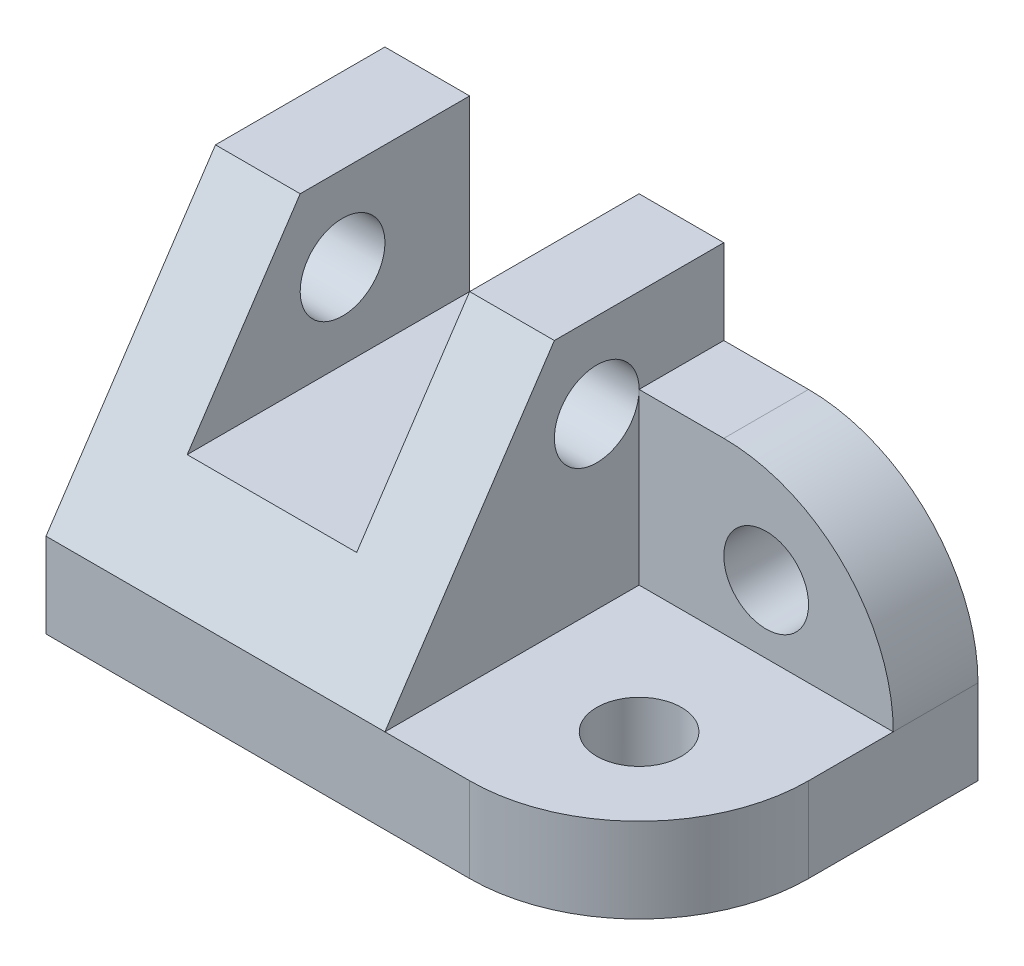
ISO-10303-21;
HEADER;
FILE_DESCRIPTION(('STEP AP214'),'2;1');
FILE_NAME('part.step','',(''),(''),'','','');
FILE_SCHEMA(('AUTOMOTIVE_DESIGN { 1 0 10303 214 1 1 1 1 }'));
ENDSEC;
DATA;
#1=APPLICATION_CONTEXT('core data for automotive mechanical design processes');
#2=APPLICATION_PROTOCOL_DEFINITION('international standard','automotive_design',2000,#1);
#3=PRODUCT_CONTEXT('',#1,'mechanical');
#4=PRODUCT('Part','Part','',(#3));
#5=PRODUCT_RELATED_PRODUCT_CATEGORY('part','',(#4));
#6=PRODUCT_DEFINITION_FORMATION('','',#4);
#7=PRODUCT_DEFINITION_CONTEXT('part definition',#1,'design');
#8=PRODUCT_DEFINITION('design','',#6,#7);
#9=PRODUCT_DEFINITION_SHAPE('','',#8);
#10=(LENGTH_UNIT() NAMED_UNIT(*) SI_UNIT(.MILLI.,.METRE.));
#11=(NAMED_UNIT(*) PLANE_ANGLE_UNIT() SI_UNIT($,.RADIAN.));
#12=(NAMED_UNIT(*) SI_UNIT($,.STERADIAN.) SOLID_ANGLE_UNIT());
#13=UNCERTAINTY_MEASURE_WITH_UNIT(LENGTH_MEASURE(1.E-05),#10,'distance_accuracy_value','');
#14=(GEOMETRIC_REPRESENTATION_CONTEXT(3) GLOBAL_UNCERTAINTY_ASSIGNED_CONTEXT((#13)) GLOBAL_UNIT_ASSIGNED_CONTEXT((#10,
#11,#12)) REPRESENTATION_CONTEXT('',''));
#15=CARTESIAN_POINT('',(0.,0.,0.));
#16=DIRECTION('',(0.,0.,1.));
#17=DIRECTION('',(1.,0.,0.));
#18=AXIS2_PLACEMENT_3D('',#15,#16,#17);
#19=CARTESIAN_POINT('',(-200.,0.,-200.));
#20=DIRECTION('',(0.,-1.,0.));
#21=DIRECTION('',(0.,0.,-1.));
#22=AXIS2_PLACEMENT_3D('',#19,#20,#21);
#23=CYLINDRICAL_SURFACE('',#22,200.);
#24=DIRECTION('',(0.,1.,0.));
#25=VECTOR('',#24,1.);
#26=CARTESIAN_POINT('',(-200.,0.,0.));
#27=LINE('',#26,#25);
#28=CARTESIAN_POINT('',(-200.,0.,0.));
#29=VERTEX_POINT('',#28);
#30=CARTESIAN_POINT('',(-200.,100.,0.));
#31=VERTEX_POINT('',#30);
#32=EDGE_CURVE('E167',#29,#31,#27,.T.);
#33=ORIENTED_EDGE('',*,*,#32,.F.);
#34=CARTESIAN_POINT('',(-200.,0.,-200.));
#35=DIRECTION('',(0.,-1.,0.));
#36=DIRECTION('',(0.,0.,-1.));
#37=AXIS2_PLACEMENT_3D('',#34,#35,#36);
#38=CIRCLE('',#37,200.);
#39=CARTESIAN_POINT('',(0.,0.,-200.));
#40=VERTEX_POINT('',#39);
#41=EDGE_CURVE('E47',#40,#29,#38,.T.);
#42=ORIENTED_EDGE('',*,*,#41,.F.);
#43=DIRECTION('',(0.,1.,0.));
#44=VECTOR('',#43,1.);
#45=CARTESIAN_POINT('',(0.,0.,-200.));
#46=LINE('',#45,#44);
#47=CARTESIAN_POINT('',(0.,100.,-200.));
#48=VERTEX_POINT('',#47);
#49=EDGE_CURVE('E245',#48,#40,#46,.F.);
#50=ORIENTED_EDGE('',*,*,#49,.F.);
#51=CARTESIAN_POINT('',(-200.,100.,-200.));
#52=DIRECTION('',(0.,-1.,0.));
#53=DIRECTION('',(0.,0.,-1.));
#54=AXIS2_PLACEMENT_3D('',#51,#52,#53);
#55=CIRCLE('',#54,200.);
#56=EDGE_CURVE('E11',#31,#48,#55,.F.);
#57=ORIENTED_EDGE('',*,*,#56,.F.);
#58=EDGE_LOOP('',(#33,#42,#50,#57));
#59=FACE_BOUND('',#58,.T.);
#60=ADVANCED_FACE('F38',(#59),#23,.T.);
#61=CARTESIAN_POINT('',(-200.,100.,-300.));
#62=DIRECTION('',(0.,0.,-1.));
#63=DIRECTION('',(-1.,0.,0.));
#64=AXIS2_PLACEMENT_3D('',#61,#62,#63);
#65=CYLINDRICAL_SURFACE('',#64,200.);
#66=DIRECTION('',(0.,0.,-1.));
#67=VECTOR('',#66,1.);
#68=CARTESIAN_POINT('',(-200.,300.,-300.));
#69=LINE('',#68,#67);
#70=CARTESIAN_POINT('',(-200.,300.,-300.));
#71=VERTEX_POINT('',#70);
#72=CARTESIAN_POINT('',(-200.,300.,-400.));
#73=VERTEX_POINT('',#72);
#74=EDGE_CURVE('E229',#71,#73,#69,.T.);
#75=ORIENTED_EDGE('',*,*,#74,.F.);
#76=CARTESIAN_POINT('',(-200.,100.,-300.));
#77=DIRECTION('',(0.,0.,-1.));
#78=DIRECTION('',(-1.,0.,0.));
#79=AXIS2_PLACEMENT_3D('',#76,#77,#78);
#80=CIRCLE('',#79,200.);
#81=CARTESIAN_POINT('',(0.,100.,-300.));
#82=VERTEX_POINT('',#81);
#83=EDGE_CURVE('E237',#82,#71,#80,.F.);
#84=ORIENTED_EDGE('',*,*,#83,.F.);
#85=DIRECTION('',(0.,0.,-1.));
#86=VECTOR('',#85,1.);
#87=CARTESIAN_POINT('',(0.,100.,0.));
#88=LINE('',#87,#86);
#89=CARTESIAN_POINT('',(0.,100.,-400.));
#90=VERTEX_POINT('',#89);
#91=EDGE_CURVE('E233',#90,#82,#88,.F.);
#92=ORIENTED_EDGE('',*,*,#91,.F.);
#93=CARTESIAN_POINT('',(-200.,100.,-400.));
#94=DIRECTION('',(0.,0.,-1.));
#95=DIRECTION('',(-1.,0.,0.));
#96=AXIS2_PLACEMENT_3D('',#93,#94,#95);
#97=CIRCLE('',#96,200.);
#98=EDGE_CURVE('E240',#73,#90,#97,.T.);
#99=ORIENTED_EDGE('',*,*,#98,.F.);
#100=EDGE_LOOP('',(#75,#84,#92,#99));
#101=FACE_BOUND('',#100,.T.);
#102=ADVANCED_FACE('F342',(#101),#65,.T.);
#103=CARTESIAN_POINT('',(-700.,400.,0.));
#104=DIRECTION('',(0.,1.,0.));
#105=DIRECTION('',(0.,0.,1.));
#106=AXIS2_PLACEMENT_3D('',#103,#104,#105);
#107=PLANE('',#106);
#108=DIRECTION('',(1.,0.,0.));
#109=VECTOR('',#108,1.);
#110=CARTESIAN_POINT('',(-700.,400.,-200.));
#111=LINE('',#110,#109);
#112=CARTESIAN_POINT('',(-400.,400.,-200.));
#113=VERTEX_POINT('',#112);
#114=CARTESIAN_POINT('',(-300.,400.,-200.));
#115=VERTEX_POINT('',#114);
#116=EDGE_CURVE('E174',#113,#115,#111,.T.);
#117=ORIENTED_EDGE('',*,*,#116,.T.);
#118=DIRECTION('',(0.,0.,1.));
#119=VECTOR('',#118,1.);
#120=CARTESIAN_POINT('',(-300.,400.,-400.));
#121=LINE('',#120,#119);
#122=CARTESIAN_POINT('',(-300.,400.,-400.));
#123=VERTEX_POINT('',#122);
#124=EDGE_CURVE('E152',#123,#115,#121,.T.);
#125=ORIENTED_EDGE('',*,*,#124,.F.);
#126=DIRECTION('',(1.,0.,0.));
#127=VECTOR('',#126,1.);
#128=CARTESIAN_POINT('',(-700.,400.,-400.));
#129=LINE('',#128,#127);
#130=CARTESIAN_POINT('',(-400.,400.,-400.));
#131=VERTEX_POINT('',#130);
#132=EDGE_CURVE('E211',#131,#123,#129,.T.);
#133=ORIENTED_EDGE('',*,*,#132,.F.);
#134=DIRECTION('',(0.,0.,-1.));
#135=VECTOR('',#134,1.);
#136=CARTESIAN_POINT('',(-400.,400.,300.));
#137=LINE('',#136,#135);
#138=EDGE_CURVE('E297',#113,#131,#137,.T.);
#139=ORIENTED_EDGE('',*,*,#138,.F.);
#140=EDGE_LOOP('',(#117,#125,#133,#139));
#141=FACE_BOUND('',#140,.T.);
#142=ADVANCED_FACE('F318',(#141),#107,.T.);
#143=CARTESIAN_POINT('',(-700.,100.,0.));
#144=DIRECTION('',(0.,-0.554700196225229,-0.832050294337844));
#145=DIRECTION('',(0.,0.832050294337844,-0.554700196225229));
#146=AXIS2_PLACEMENT_3D('',#143,#144,#145);
#147=PLANE('',#146);
#148=DIRECTION('',(0.,-0.832050294337844,0.554700196225229));
#149=VECTOR('',#148,1.);
#150=CARTESIAN_POINT('',(-300.,400.,-200.));
#151=LINE('',#150,#149);
#152=CARTESIAN_POINT('',(-300.,100.,0.));
#153=VERTEX_POINT('',#152);
#154=EDGE_CURVE('E147',#115,#153,#151,.T.);
#155=ORIENTED_EDGE('',*,*,#154,.F.);
#156=ORIENTED_EDGE('',*,*,#116,.F.);
#157=DIRECTION('',(0.,-0.832050294337844,0.554700196225229));
#158=VECTOR('',#157,1.);
#159=CARTESIAN_POINT('',(-400.,100.,0.));
#160=LINE('',#159,#158);
#161=CARTESIAN_POINT('',(-400.,200.,-66.6666666666666));
#162=VERTEX_POINT('',#161);
#163=EDGE_CURVE('E210',#113,#162,#160,.T.);
#164=ORIENTED_EDGE('',*,*,#163,.T.);
#165=DIRECTION('',(-1.,0.,0.));
#166=VECTOR('',#165,1.);
#167=CARTESIAN_POINT('',(-700.,200.,-66.6666666666667));
#168=LINE('',#167,#166);
#169=CARTESIAN_POINT('',(-600.,200.,-66.6666666666667));
#170=VERTEX_POINT('',#169);
#171=EDGE_CURVE('E221',#162,#170,#168,.T.);
#172=ORIENTED_EDGE('',*,*,#171,.T.);
#173=DIRECTION('',(0.,0.832050294337844,-0.554700196225229));
#174=VECTOR('',#173,1.);
#175=CARTESIAN_POINT('',(-600.,100.,0.));
#176=LINE('',#175,#174);
#177=CARTESIAN_POINT('',(-600.,400.,-200.));
#178=VERTEX_POINT('',#177);
#179=EDGE_CURVE('E225',#170,#178,#176,.T.);
#180=ORIENTED_EDGE('',*,*,#179,.T.);
#181=CARTESIAN_POINT('',(-700.,400.,-200.));
#182=VERTEX_POINT('',#181);
#183=EDGE_CURVE('E178',#182,#178,#111,.T.);
#184=ORIENTED_EDGE('',*,*,#183,.F.);
#185=DIRECTION('',(0.,0.832050294337844,-0.554700196225229));
#186=VECTOR('',#185,1.);
#187=CARTESIAN_POINT('',(-700.,100.,0.));
#188=LINE('',#187,#186);
#189=CARTESIAN_POINT('',(-700.,100.,0.));
#190=VERTEX_POINT('',#189);
#191=EDGE_CURVE('E172',#190,#182,#188,.T.);
#192=ORIENTED_EDGE('',*,*,#191,.F.);
#193=DIRECTION('',(1.,0.,0.));
#194=VECTOR('',#193,1.);
#195=CARTESIAN_POINT('',(-700.,100.,0.));
#196=LINE('',#195,#194);
#197=EDGE_CURVE('E165',#190,#153,#196,.T.);
#198=ORIENTED_EDGE('',*,*,#197,.T.);
#199=EDGE_LOOP('',(#155,#156,#164,#172,#180,#184,#192,#198));
#200=FACE_BOUND('',#199,.T.);
#201=ADVANCED_FACE('F170',(#200),#147,.F.);
#202=DIRECTION('',(0.,0.,-1.));
#203=VECTOR('',#202,1.);
#204=CARTESIAN_POINT('',(-600.,400.,300.));
#205=LINE('',#204,#203);
#206=CARTESIAN_POINT('',(-600.,400.,-400.));
#207=VERTEX_POINT('',#206);
#208=EDGE_CURVE('E180',#178,#207,#205,.T.);
#209=ORIENTED_EDGE('',*,*,#208,.T.);
#210=CARTESIAN_POINT('',(-700.,400.,-400.));
#211=VERTEX_POINT('',#210);
#212=EDGE_CURVE('E206',#211,#207,#129,.T.);
#213=ORIENTED_EDGE('',*,*,#212,.F.);
#214=DIRECTION('',(0.,0.,1.));
#215=VECTOR('',#214,1.);
#216=CARTESIAN_POINT('',(-700.,400.,0.));
#217=LINE('',#216,#215);
#218=EDGE_CURVE('E195',#211,#182,#217,.T.);
#219=ORIENTED_EDGE('',*,*,#218,.T.);
#220=ORIENTED_EDGE('',*,*,#183,.T.);
#221=EDGE_LOOP('',(#209,#213,#219,#220));
#222=FACE_BOUND('',#221,.T.);
#223=ADVANCED_FACE('F323',(#222),#107,.T.);
#224=CARTESIAN_POINT('',(-700.,0.,0.));
#225=DIRECTION('',(0.,0.,1.));
#226=DIRECTION('',(1.,0.,0.));
#227=AXIS2_PLACEMENT_3D('',#224,#225,#226);
#228=PLANE('',#227);
#229=DIRECTION('',(1.,0.,0.));
#230=VECTOR('',#229,1.);
#231=CARTESIAN_POINT('',(-700.,0.,0.));
#232=LINE('',#231,#230);
#233=CARTESIAN_POINT('',(-700.,0.,0.));
#234=VERTEX_POINT('',#233);
#235=EDGE_CURVE('E199',#234,#29,#232,.T.);
#236=ORIENTED_EDGE('',*,*,#235,.T.);
#237=ORIENTED_EDGE('',*,*,#32,.T.);
#238=DIRECTION('',(1.,0.,0.));
#239=VECTOR('',#238,1.);
#240=CARTESIAN_POINT('',(-300.,100.,0.));
#241=LINE('',#240,#239);
#242=EDGE_CURVE('E139',#153,#31,#241,.T.);
#243=ORIENTED_EDGE('',*,*,#242,.F.);
#244=ORIENTED_EDGE('',*,*,#197,.F.);
#245=DIRECTION('',(0.,-1.,0.));
#246=VECTOR('',#245,1.);
#247=CARTESIAN_POINT('',(-700.,0.,0.));
#248=LINE('',#247,#246);
#249=EDGE_CURVE('E183',#190,#234,#248,.T.);
#250=ORIENTED_EDGE('',*,*,#249,.T.);
#251=EDGE_LOOP('',(#236,#237,#243,#244,#250));
#252=FACE_BOUND('',#251,.T.);
#253=ADVANCED_FACE('F164',(#252),#228,.T.);
#254=CARTESIAN_POINT('',(-700.,400.,-400.));
#255=DIRECTION('',(0.,0.,-1.));
#256=DIRECTION('',(-1.,0.,0.));
#257=AXIS2_PLACEMENT_3D('',#254,#255,#256);
#258=PLANE('',#257);
#259=CARTESIAN_POINT('',(-150.,180.,-400.));
#260=DIRECTION('',(0.,0.,-1.));
#261=DIRECTION('',(-1.,0.,0.));
#262=AXIS2_PLACEMENT_3D('',#259,#260,#261);
#263=CIRCLE('',#262,50.);
#264=CARTESIAN_POINT('',(-200.,180.,-400.));
#265=VERTEX_POINT('',#264);
#266=EDGE_CURVE('E478',#265,#265,#263,.T.);
#267=ORIENTED_EDGE('',*,*,#266,.F.);
#268=EDGE_LOOP('',(#267));
#269=FACE_BOUND('',#268,.T.);
#270=DIRECTION('',(1.,0.,0.));
#271=VECTOR('',#270,1.);
#272=CARTESIAN_POINT('',(-300.,300.,-400.));
#273=LINE('',#272,#271);
#274=CARTESIAN_POINT('',(-300.,300.,-400.));
#275=VERTEX_POINT('',#274);
#276=EDGE_CURVE('E277',#275,#73,#273,.T.);
#277=ORIENTED_EDGE('',*,*,#276,.T.);
#278=ORIENTED_EDGE('',*,*,#98,.T.);
#279=DIRECTION('',(0.,1.,0.));
#280=VECTOR('',#279,1.);
#281=CARTESIAN_POINT('',(0.,400.,-400.));
#282=LINE('',#281,#280);
#283=CARTESIAN_POINT('',(0.,0.,-400.));
#284=VERTEX_POINT('',#283);
#285=EDGE_CURVE('E187',#284,#90,#282,.T.);
#286=ORIENTED_EDGE('',*,*,#285,.F.);
#287=DIRECTION('',(1.,0.,0.));
#288=VECTOR('',#287,1.);
#289=CARTESIAN_POINT('',(-700.,0.,-400.));
#290=LINE('',#289,#288);
#291=CARTESIAN_POINT('',(-700.,0.,-400.));
#292=VERTEX_POINT('',#291);
#293=EDGE_CURVE('E212',#292,#284,#290,.T.);
#294=ORIENTED_EDGE('',*,*,#293,.F.);
#295=DIRECTION('',(0.,1.,0.));
#296=VECTOR('',#295,1.);
#297=CARTESIAN_POINT('',(-700.,400.,-400.));
#298=LINE('',#297,#296);
#299=EDGE_CURVE('E191',#292,#211,#298,.T.);
#300=ORIENTED_EDGE('',*,*,#299,.T.);
#301=ORIENTED_EDGE('',*,*,#212,.T.);
#302=DIRECTION('',(0.,1.,0.));
#303=VECTOR('',#302,1.);
#304=CARTESIAN_POINT('',(-600.,400.,-400.));
#305=LINE('',#304,#303);
#306=CARTESIAN_POINT('',(-600.,200.,-400.));
#307=VERTEX_POINT('',#306);
#308=EDGE_CURVE('E294',#307,#207,#305,.T.);
#309=ORIENTED_EDGE('',*,*,#308,.F.);
#310=DIRECTION('',(-1.,0.,0.));
#311=VECTOR('',#310,1.);
#312=CARTESIAN_POINT('',(-600.,200.,-400.));
#313=LINE('',#312,#311);
#314=CARTESIAN_POINT('',(-400.,200.,-400.));
#315=VERTEX_POINT('',#314);
#316=EDGE_CURVE('E290',#315,#307,#313,.T.);
#317=ORIENTED_EDGE('',*,*,#316,.F.);
#318=DIRECTION('',(0.,-1.,0.));
#319=VECTOR('',#318,1.);
#320=CARTESIAN_POINT('',(-400.,200.,-400.));
#321=LINE('',#320,#319);
#322=EDGE_CURVE('E280',#131,#315,#321,.T.);
#323=ORIENTED_EDGE('',*,*,#322,.F.);
#324=ORIENTED_EDGE('',*,*,#132,.T.);
#325=DIRECTION('',(0.,1.,0.));
#326=VECTOR('',#325,1.);
#327=CARTESIAN_POINT('',(-300.,300.,-400.));
#328=LINE('',#327,#326);
#329=EDGE_CURVE('E491',#275,#123,#328,.T.);
#330=ORIENTED_EDGE('',*,*,#329,.F.);
#331=EDGE_LOOP('',(#277,#278,#286,#294,#300,#301,#309,#317,#323,#324,#330));
#332=FACE_BOUND('',#331,.T.);
#333=ADVANCED_FACE('F261',(#269,#332),#258,.T.);
#334=CARTESIAN_POINT('',(-700.,0.,0.));
#335=DIRECTION('',(0.,-1.,0.));
#336=DIRECTION('',(0.,0.,-1.));
#337=AXIS2_PLACEMENT_3D('',#334,#335,#336);
#338=PLANE('',#337);
#339=CARTESIAN_POINT('',(-150.,0.,-150.));
#340=DIRECTION('',(0.,-1.,0.));
#341=DIRECTION('',(0.,0.,-1.));
#342=AXIS2_PLACEMENT_3D('',#339,#340,#341);
#343=CIRCLE('',#342,50.);
#344=CARTESIAN_POINT('',(-150.,0.,-200.));
#345=VERTEX_POINT('',#344);
#346=EDGE_CURVE('E268',#345,#345,#343,.T.);
#347=ORIENTED_EDGE('',*,*,#346,.F.);
#348=EDGE_LOOP('',(#347));
#349=FACE_BOUND('',#348,.T.);
#350=DIRECTION('',(0.,0.,-1.));
#351=VECTOR('',#350,1.);
#352=CARTESIAN_POINT('',(0.,0.,0.));
#353=LINE('',#352,#351);
#354=EDGE_CURVE('E200',#40,#284,#353,.T.);
#355=ORIENTED_EDGE('',*,*,#354,.F.);
#356=ORIENTED_EDGE('',*,*,#41,.T.);
#357=ORIENTED_EDGE('',*,*,#235,.F.);
#358=DIRECTION('',(0.,0.,-1.));
#359=VECTOR('',#358,1.);
#360=CARTESIAN_POINT('',(-700.,0.,0.));
#361=LINE('',#360,#359);
#362=EDGE_CURVE('E186',#234,#292,#361,.T.);
#363=ORIENTED_EDGE('',*,*,#362,.T.);
#364=ORIENTED_EDGE('',*,*,#293,.T.);
#365=EDGE_LOOP('',(#355,#356,#357,#363,#364));
#366=FACE_BOUND('',#365,.T.);
#367=ADVANCED_FACE('F252',(#349,#366),#338,.T.);
#368=CARTESIAN_POINT('',(-700.,0.,0.));
#369=DIRECTION('',(-1.,0.,0.));
#370=DIRECTION('',(0.,0.,1.));
#371=AXIS2_PLACEMENT_3D('',#368,#369,#370);
#372=PLANE('',#371);
#373=CARTESIAN_POINT('',(-700.,300.,-250.));
#374=DIRECTION('',(-1.,0.,0.));
#375=DIRECTION('',(0.,0.,1.));
#376=AXIS2_PLACEMENT_3D('',#373,#374,#375);
#377=CIRCLE('',#376,50.);
#378=CARTESIAN_POINT('',(-700.,300.,-200.));
#379=VERTEX_POINT('',#378);
#380=EDGE_CURVE('E500',#379,#379,#377,.T.);
#381=ORIENTED_EDGE('',*,*,#380,.F.);
#382=EDGE_LOOP('',(#381));
#383=FACE_BOUND('',#382,.T.);
#384=ORIENTED_EDGE('',*,*,#191,.T.);
#385=ORIENTED_EDGE('',*,*,#218,.F.);
#386=ORIENTED_EDGE('',*,*,#299,.F.);
#387=ORIENTED_EDGE('',*,*,#362,.F.);
#388=ORIENTED_EDGE('',*,*,#249,.F.);
#389=EDGE_LOOP('',(#384,#385,#386,#387,#388));
#390=FACE_BOUND('',#389,.T.);
#391=ADVANCED_FACE('F255',(#383,#390),#372,.T.);
#392=CARTESIAN_POINT('',(0.,0.,0.));
#393=DIRECTION('',(-1.,0.,0.));
#394=DIRECTION('',(0.,0.,1.));
#395=AXIS2_PLACEMENT_3D('',#392,#393,#394);
#396=PLANE('',#395);
#397=DIRECTION('',(0.,0.,-1.));
#398=VECTOR('',#397,1.);
#399=CARTESIAN_POINT('',(0.,100.,0.));
#400=LINE('',#399,#398);
#401=EDGE_CURVE('E158',#48,#82,#400,.T.);
#402=ORIENTED_EDGE('',*,*,#401,.F.);
#403=ORIENTED_EDGE('',*,*,#49,.T.);
#404=ORIENTED_EDGE('',*,*,#354,.T.);
#405=ORIENTED_EDGE('',*,*,#285,.T.);
#406=ORIENTED_EDGE('',*,*,#91,.T.);
#407=EDGE_LOOP('',(#402,#403,#404,#405,#406));
#408=FACE_BOUND('',#407,.T.);
#409=ADVANCED_FACE('F265',(#408),#396,.F.);
#410=CARTESIAN_POINT('',(-600.,400.,300.));
#411=DIRECTION('',(-1.,0.,0.));
#412=DIRECTION('',(0.,0.,1.));
#413=AXIS2_PLACEMENT_3D('',#410,#411,#412);
#414=PLANE('',#413);
#415=CARTESIAN_POINT('',(-600.,300.,-250.));
#416=DIRECTION('',(-1.,0.,0.));
#417=DIRECTION('',(0.,0.,1.));
#418=AXIS2_PLACEMENT_3D('',#415,#416,#417);
#419=CIRCLE('',#418,50.);
#420=CARTESIAN_POINT('',(-600.,300.,-200.));
#421=VERTEX_POINT('',#420);
#422=EDGE_CURVE('E504',#421,#421,#419,.T.);
#423=ORIENTED_EDGE('',*,*,#422,.T.);
#424=EDGE_LOOP('',(#423));
#425=FACE_BOUND('',#424,.T.);
#426=DIRECTION('',(0.,0.,-1.));
#427=VECTOR('',#426,1.);
#428=CARTESIAN_POINT('',(-600.,200.,300.));
#429=LINE('',#428,#427);
#430=EDGE_CURVE('E301',#170,#307,#429,.T.);
#431=ORIENTED_EDGE('',*,*,#430,.T.);
#432=ORIENTED_EDGE('',*,*,#308,.T.);
#433=ORIENTED_EDGE('',*,*,#208,.F.);
#434=ORIENTED_EDGE('',*,*,#179,.F.);
#435=EDGE_LOOP('',(#431,#432,#433,#434));
#436=FACE_BOUND('',#435,.T.);
#437=ADVANCED_FACE('F327',(#425,#436),#414,.F.);
#438=CARTESIAN_POINT('',(-600.,200.,300.));
#439=DIRECTION('',(0.,-1.,0.));
#440=DIRECTION('',(1.,0.,0.));
#441=AXIS2_PLACEMENT_3D('',#438,#439,#440);
#442=PLANE('',#441);
#443=DIRECTION('',(0.,0.,-1.));
#444=VECTOR('',#443,1.);
#445=CARTESIAN_POINT('',(-400.,200.,300.));
#446=LINE('',#445,#444);
#447=EDGE_CURVE('E304',#162,#315,#446,.T.);
#448=ORIENTED_EDGE('',*,*,#447,.T.);
#449=ORIENTED_EDGE('',*,*,#316,.T.);
#450=ORIENTED_EDGE('',*,*,#430,.F.);
#451=ORIENTED_EDGE('',*,*,#171,.F.);
#452=EDGE_LOOP('',(#448,#449,#450,#451));
#453=FACE_BOUND('',#452,.T.);
#454=ADVANCED_FACE('F329',(#453),#442,.F.);
#455=CARTESIAN_POINT('',(-400.,200.,300.));
#456=DIRECTION('',(1.,0.,0.));
#457=DIRECTION('',(0.,0.,-1.));
#458=AXIS2_PLACEMENT_3D('',#455,#456,#457);
#459=PLANE('',#458);
#460=CARTESIAN_POINT('',(-400.,300.,-250.));
#461=DIRECTION('',(1.,0.,0.));
#462=DIRECTION('',(0.,0.,-1.));
#463=AXIS2_PLACEMENT_3D('',#460,#461,#462);
#464=CIRCLE('',#463,50.);
#465=CARTESIAN_POINT('',(-400.,300.,-300.));
#466=VERTEX_POINT('',#465);
#467=EDGE_CURVE('E499',#466,#466,#464,.T.);
#468=ORIENTED_EDGE('',*,*,#467,.T.);
#469=EDGE_LOOP('',(#468));
#470=FACE_BOUND('',#469,.T.);
#471=ORIENTED_EDGE('',*,*,#138,.T.);
#472=ORIENTED_EDGE('',*,*,#322,.T.);
#473=ORIENTED_EDGE('',*,*,#447,.F.);
#474=ORIENTED_EDGE('',*,*,#163,.F.);
#475=EDGE_LOOP('',(#471,#472,#473,#474));
#476=FACE_BOUND('',#475,.T.);
#477=ADVANCED_FACE('F311',(#470,#476),#459,.F.);
#478=CARTESIAN_POINT('',(-300.,300.,-300.));
#479=DIRECTION('',(0.,-1.,0.));
#480=DIRECTION('',(0.,0.,-1.));
#481=AXIS2_PLACEMENT_3D('',#478,#479,#480);
#482=PLANE('',#481);
#483=DIRECTION('',(1.,0.,0.));
#484=VECTOR('',#483,1.);
#485=CARTESIAN_POINT('',(-300.,300.,-300.));
#486=LINE('',#485,#484);
#487=CARTESIAN_POINT('',(-300.,300.,-300.));
#488=VERTEX_POINT('',#487);
#489=EDGE_CURVE('E281',#488,#71,#486,.T.);
#490=ORIENTED_EDGE('',*,*,#489,.T.);
#491=ORIENTED_EDGE('',*,*,#74,.T.);
#492=ORIENTED_EDGE('',*,*,#276,.F.);
#493=DIRECTION('',(0.,0.,-1.));
#494=VECTOR('',#493,1.);
#495=CARTESIAN_POINT('',(-300.,300.,-300.));
#496=LINE('',#495,#494);
#497=EDGE_CURVE('E488',#488,#275,#496,.T.);
#498=ORIENTED_EDGE('',*,*,#497,.F.);
#499=EDGE_LOOP('',(#490,#491,#492,#498));
#500=FACE_BOUND('',#499,.T.);
#501=ADVANCED_FACE('F336',(#500),#482,.F.);
#502=CARTESIAN_POINT('',(-300.,100.,-300.));
#503=DIRECTION('',(0.,0.,-1.));
#504=DIRECTION('',(-1.,0.,0.));
#505=AXIS2_PLACEMENT_3D('',#502,#503,#504);
#506=PLANE('',#505);
#507=CARTESIAN_POINT('',(-150.,180.,-300.));
#508=DIRECTION('',(0.,0.,1.));
#509=DIRECTION('',(1.,0.,0.));
#510=AXIS2_PLACEMENT_3D('',#507,#508,#509);
#511=CIRCLE('',#510,50.);
#512=CARTESIAN_POINT('',(-100.,180.,-300.));
#513=VERTEX_POINT('',#512);
#514=EDGE_CURVE('E482',#513,#513,#511,.T.);
#515=ORIENTED_EDGE('',*,*,#514,.F.);
#516=EDGE_LOOP('',(#515));
#517=FACE_BOUND('',#516,.T.);
#518=DIRECTION('',(1.,0.,0.));
#519=VECTOR('',#518,1.);
#520=CARTESIAN_POINT('',(-300.,100.,-300.));
#521=LINE('',#520,#519);
#522=CARTESIAN_POINT('',(-300.,100.,-300.));
#523=VERTEX_POINT('',#522);
#524=EDGE_CURVE('E141',#523,#82,#521,.T.);
#525=ORIENTED_EDGE('',*,*,#524,.T.);
#526=ORIENTED_EDGE('',*,*,#83,.T.);
#527=ORIENTED_EDGE('',*,*,#489,.F.);
#528=DIRECTION('',(0.,1.,0.));
#529=VECTOR('',#528,1.);
#530=CARTESIAN_POINT('',(-300.,100.,-300.));
#531=LINE('',#530,#529);
#532=EDGE_CURVE('E146',#523,#488,#531,.T.);
#533=ORIENTED_EDGE('',*,*,#532,.F.);
#534=EDGE_LOOP('',(#525,#526,#527,#533));
#535=FACE_BOUND('',#534,.T.);
#536=ADVANCED_FACE('F415',(#517,#535),#506,.F.);
#537=CARTESIAN_POINT('',(-300.,100.,0.));
#538=DIRECTION('',(0.,-1.,0.));
#539=DIRECTION('',(0.,0.,-1.));
#540=AXIS2_PLACEMENT_3D('',#537,#538,#539);
#541=PLANE('',#540);
#542=CARTESIAN_POINT('',(-150.,100.,-150.));
#543=DIRECTION('',(0.,1.,0.));
#544=DIRECTION('',(0.,0.,1.));
#545=AXIS2_PLACEMENT_3D('',#542,#543,#544);
#546=CIRCLE('',#545,50.);
#547=CARTESIAN_POINT('',(-150.,100.,-100.));
#548=VERTEX_POINT('',#547);
#549=EDGE_CURVE('E272',#548,#548,#546,.T.);
#550=ORIENTED_EDGE('',*,*,#549,.F.);
#551=EDGE_LOOP('',(#550));
#552=FACE_BOUND('',#551,.T.);
#553=ORIENTED_EDGE('',*,*,#242,.T.);
#554=ORIENTED_EDGE('',*,*,#56,.T.);
#555=ORIENTED_EDGE('',*,*,#401,.T.);
#556=ORIENTED_EDGE('',*,*,#524,.F.);
#557=DIRECTION('',(0.,0.,-1.));
#558=VECTOR('',#557,1.);
#559=CARTESIAN_POINT('',(-300.,100.,0.));
#560=LINE('',#559,#558);
#561=EDGE_CURVE('E135',#153,#523,#560,.T.);
#562=ORIENTED_EDGE('',*,*,#561,.F.);
#563=EDGE_LOOP('',(#553,#554,#555,#556,#562));
#564=FACE_BOUND('',#563,.T.);
#565=ADVANCED_FACE('F137',(#552,#564),#541,.F.);
#566=CARTESIAN_POINT('',(-300.,0.,0.));
#567=DIRECTION('',(1.,0.,0.));
#568=DIRECTION('',(0.,0.,-1.));
#569=AXIS2_PLACEMENT_3D('',#566,#567,#568);
#570=PLANE('',#569);
#571=ORIENTED_EDGE('',*,*,#532,.T.);
#572=CARTESIAN_POINT('',(-300.,300.,-250.));
#573=DIRECTION('',(1.,0.,0.));
#574=DIRECTION('',(0.,0.,-1.));
#575=AXIS2_PLACEMENT_3D('',#572,#573,#574);
#576=CIRCLE('',#575,50.);
#577=EDGE_CURVE('E41',#488,#488,#576,.T.);
#578=ORIENTED_EDGE('',*,*,#577,.F.);
#579=ORIENTED_EDGE('',*,*,#497,.T.);
#580=ORIENTED_EDGE('',*,*,#329,.T.);
#581=ORIENTED_EDGE('',*,*,#124,.T.);
#582=ORIENTED_EDGE('',*,*,#154,.T.);
#583=ORIENTED_EDGE('',*,*,#561,.T.);
#584=EDGE_LOOP('',(#571,#578,#579,#580,#581,#582,#583));
#585=FACE_BOUND('',#584,.T.);
#586=ADVANCED_FACE('F150',(#585),#570,.T.);
#587=CARTESIAN_POINT('',(-150.,-200.,-150.));
#588=DIRECTION('',(0.,1.,0.));
#589=DIRECTION('',(0.,0.,1.));
#590=AXIS2_PLACEMENT_3D('',#587,#588,#589);
#591=CYLINDRICAL_SURFACE('',#590,50.);
#592=ORIENTED_EDGE('',*,*,#346,.T.);
#593=EDGE_LOOP('',(#592));
#594=FACE_BOUND('',#593,.T.);
#595=ORIENTED_EDGE('',*,*,#549,.T.);
#596=EDGE_LOOP('',(#595));
#597=FACE_BOUND('',#596,.T.);
#598=ADVANCED_FACE('F437',(#594,#597),#591,.F.);
#599=CARTESIAN_POINT('',(-150.,180.,-528.));
#600=DIRECTION('',(0.,0.,1.));
#601=DIRECTION('',(1.,0.,0.));
#602=AXIS2_PLACEMENT_3D('',#599,#600,#601);
#603=CYLINDRICAL_SURFACE('',#602,50.);
#604=ORIENTED_EDGE('',*,*,#266,.T.);
#605=EDGE_LOOP('',(#604));
#606=FACE_BOUND('',#605,.T.);
#607=ORIENTED_EDGE('',*,*,#514,.T.);
#608=EDGE_LOOP('',(#607));
#609=FACE_BOUND('',#608,.T.);
#610=ADVANCED_FACE('F450',(#606,#609),#603,.F.);
#611=CARTESIAN_POINT('',(7.9999999999999,300.,-250.));
#612=DIRECTION('',(-1.,0.,0.));
#613=DIRECTION('',(0.,0.,1.));
#614=AXIS2_PLACEMENT_3D('',#611,#612,#613);
#615=CYLINDRICAL_SURFACE('',#614,50.);
#616=ORIENTED_EDGE('',*,*,#577,.T.);
#617=EDGE_LOOP('',(#616));
#618=FACE_BOUND('',#617,.T.);
#619=ORIENTED_EDGE('',*,*,#467,.F.);
#620=EDGE_LOOP('',(#619));
#621=FACE_BOUND('',#620,.T.);
#622=ADVANCED_FACE('F444',(#618,#621),#615,.F.);
#623=ORIENTED_EDGE('',*,*,#380,.T.);
#624=EDGE_LOOP('',(#623));
#625=FACE_BOUND('',#624,.T.);
#626=ORIENTED_EDGE('',*,*,#422,.F.);
#627=EDGE_LOOP('',(#626));
#628=FACE_BOUND('',#627,.T.);
#629=ADVANCED_FACE('F449',(#625,#628),#615,.F.);
#630=CLOSED_SHELL('',(#60,#102,#142,#201,#223,#253,#333,#367,#391,#409,#437,#454,#477,#501,#536,
#565,#586,#598,#610,#622,#629));
#631=MANIFOLD_SOLID_BREP('B2',#630);
#632=ADVANCED_BREP_SHAPE_REPRESENTATION('',(#18,#631),#14);
#633=SHAPE_DEFINITION_REPRESENTATION(#9,#632);
ENDSEC;
END-ISO-10303-21;
